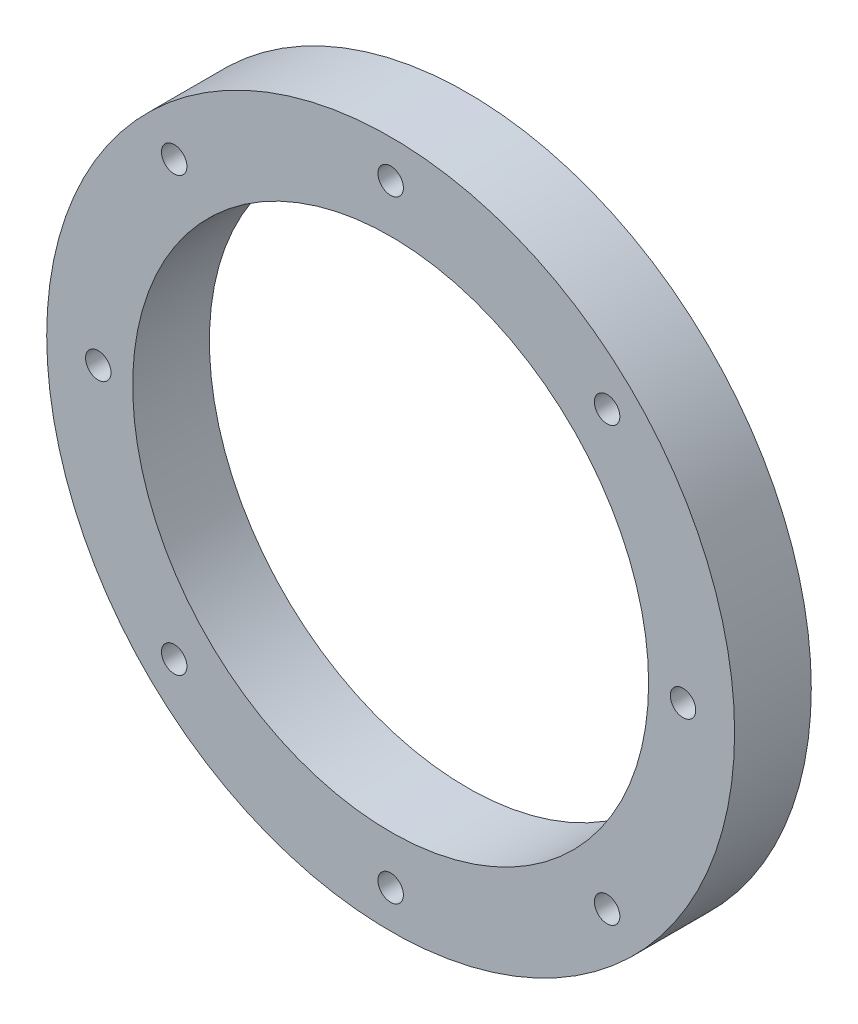
ISO-10303-21;
HEADER;
FILE_DESCRIPTION(('STEP AP214'),'2;1');
FILE_NAME('part.step','',(''),(''),'','','');
FILE_SCHEMA(('AUTOMOTIVE_DESIGN { 1 0 10303 214 1 1 1 1 }'));
ENDSEC;
DATA;
#1=APPLICATION_CONTEXT('core data for automotive mechanical design processes');
#2=APPLICATION_PROTOCOL_DEFINITION('international standard','automotive_design',2000,#1);
#3=PRODUCT_CONTEXT('',#1,'mechanical');
#4=PRODUCT('Part','Part','',(#3));
#5=PRODUCT_RELATED_PRODUCT_CATEGORY('part','',(#4));
#6=PRODUCT_DEFINITION_FORMATION('','',#4);
#7=PRODUCT_DEFINITION_CONTEXT('part definition',#1,'design');
#8=PRODUCT_DEFINITION('design','',#6,#7);
#9=PRODUCT_DEFINITION_SHAPE('','',#8);
#10=(LENGTH_UNIT() NAMED_UNIT(*) SI_UNIT(.MILLI.,.METRE.));
#11=(NAMED_UNIT(*) PLANE_ANGLE_UNIT() SI_UNIT($,.RADIAN.));
#12=(NAMED_UNIT(*) SI_UNIT($,.STERADIAN.) SOLID_ANGLE_UNIT());
#13=UNCERTAINTY_MEASURE_WITH_UNIT(LENGTH_MEASURE(1.E-05),#10,'distance_accuracy_value','');
#14=(GEOMETRIC_REPRESENTATION_CONTEXT(3) GLOBAL_UNCERTAINTY_ASSIGNED_CONTEXT((#13)) GLOBAL_UNIT_ASSIGNED_CONTEXT((#10,
#11,#12)) REPRESENTATION_CONTEXT('',''));
#15=CARTESIAN_POINT('',(0.,0.,0.));
#16=DIRECTION('',(0.,0.,1.));
#17=DIRECTION('',(1.,0.,0.));
#18=AXIS2_PLACEMENT_3D('',#15,#16,#17);
#19=CARTESIAN_POINT('',(0.,0.,11.15));
#20=DIRECTION('',(0.,0.,-1.));
#21=DIRECTION('',(-1.,0.,0.));
#22=AXIS2_PLACEMENT_3D('',#19,#20,#21);
#23=CYLINDRICAL_SURFACE('',#22,37.5);
#24=CARTESIAN_POINT('',(0.,0.,11.15));
#25=DIRECTION('',(0.,0.,1.));
#26=DIRECTION('',(1.,0.,0.));
#27=AXIS2_PLACEMENT_3D('',#24,#25,#26);
#28=CIRCLE('',#27,37.5);
#29=CARTESIAN_POINT('',(37.5,0.,11.15));
#30=VERTEX_POINT('',#29);
#31=EDGE_CURVE('E52',#30,#30,#28,.T.);
#32=ORIENTED_EDGE('',*,*,#31,.T.);
#33=EDGE_LOOP('',(#32));
#34=FACE_BOUND('',#33,.T.);
#35=CARTESIAN_POINT('',(0.,0.,0.));
#36=DIRECTION('',(0.,0.,1.));
#37=DIRECTION('',(1.,0.,0.));
#38=AXIS2_PLACEMENT_3D('',#35,#36,#37);
#39=CIRCLE('',#38,37.5);
#40=CARTESIAN_POINT('',(37.5,0.,0.));
#41=VERTEX_POINT('',#40);
#42=EDGE_CURVE('E93',#41,#41,#39,.T.);
#43=ORIENTED_EDGE('',*,*,#42,.F.);
#44=EDGE_LOOP('',(#43));
#45=FACE_BOUND('',#44,.T.);
#46=ADVANCED_FACE('F43',(#34,#45),#23,.F.);
#47=CARTESIAN_POINT('',(0.,44.5,11.15));
#48=DIRECTION('',(0.,0.,-1.));
#49=DIRECTION('',(-1.,0.,0.));
#50=AXIS2_PLACEMENT_3D('',#47,#48,#49);
#51=CYLINDRICAL_SURFACE('',#50,1.85);
#52=CARTESIAN_POINT('',(0.,44.5,11.15));
#53=DIRECTION('',(0.,0.,1.));
#54=DIRECTION('',(1.,0.,0.));
#55=AXIS2_PLACEMENT_3D('',#52,#53,#54);
#56=CIRCLE('',#55,1.85);
#57=CARTESIAN_POINT('',(1.85,44.5,11.15));
#58=VERTEX_POINT('',#57);
#59=EDGE_CURVE('E58',#58,#58,#56,.T.);
#60=ORIENTED_EDGE('',*,*,#59,.T.);
#61=EDGE_LOOP('',(#60));
#62=FACE_BOUND('',#61,.T.);
#63=CARTESIAN_POINT('',(0.,44.5,0.));
#64=DIRECTION('',(0.,0.,1.));
#65=DIRECTION('',(1.,0.,0.));
#66=AXIS2_PLACEMENT_3D('',#63,#64,#65);
#67=CIRCLE('',#66,1.85);
#68=CARTESIAN_POINT('',(1.85,44.5,0.));
#69=VERTEX_POINT('',#68);
#70=EDGE_CURVE('E90',#69,#69,#67,.T.);
#71=ORIENTED_EDGE('',*,*,#70,.F.);
#72=EDGE_LOOP('',(#71));
#73=FACE_BOUND('',#72,.T.);
#74=ADVANCED_FACE('F136',(#62,#73),#51,.F.);
#75=CARTESIAN_POINT('',(31.4662517628014,31.4662517628014,11.15));
#76=DIRECTION('',(0.,0.,-1.));
#77=DIRECTION('',(-1.,0.,0.));
#78=AXIS2_PLACEMENT_3D('',#75,#76,#77);
#79=CYLINDRICAL_SURFACE('',#78,1.85);
#80=CARTESIAN_POINT('',(31.4662517628014,31.4662517628014,11.15));
#81=DIRECTION('',(0.,0.,1.));
#82=DIRECTION('',(1.,0.,0.));
#83=AXIS2_PLACEMENT_3D('',#80,#81,#82);
#84=CIRCLE('',#83,1.85);
#85=CARTESIAN_POINT('',(33.3162517628014,31.4662517628014,11.15));
#86=VERTEX_POINT('',#85);
#87=EDGE_CURVE('E129',#86,#86,#84,.T.);
#88=ORIENTED_EDGE('',*,*,#87,.T.);
#89=EDGE_LOOP('',(#88));
#90=FACE_BOUND('',#89,.T.);
#91=CARTESIAN_POINT('',(31.4662517628014,31.4662517628014,0.));
#92=DIRECTION('',(0.,0.,1.));
#93=DIRECTION('',(1.,0.,0.));
#94=AXIS2_PLACEMENT_3D('',#91,#92,#93);
#95=CIRCLE('',#94,1.85);
#96=CARTESIAN_POINT('',(33.3162517628014,31.4662517628014,0.));
#97=VERTEX_POINT('',#96);
#98=EDGE_CURVE('E86',#97,#97,#95,.T.);
#99=ORIENTED_EDGE('',*,*,#98,.F.);
#100=EDGE_LOOP('',(#99));
#101=FACE_BOUND('',#100,.T.);
#102=ADVANCED_FACE('F154',(#90,#101),#79,.F.);
#103=CARTESIAN_POINT('',(42.5,0.,11.15));
#104=DIRECTION('',(0.,0.,-1.));
#105=DIRECTION('',(-1.,0.,0.));
#106=AXIS2_PLACEMENT_3D('',#103,#104,#105);
#107=CYLINDRICAL_SURFACE('',#106,1.85);
#108=CARTESIAN_POINT('',(42.5,0.,11.15));
#109=DIRECTION('',(0.,0.,1.));
#110=DIRECTION('',(1.,0.,0.));
#111=AXIS2_PLACEMENT_3D('',#108,#109,#110);
#112=CIRCLE('',#111,1.85);
#113=CARTESIAN_POINT('',(44.35,0.,11.15));
#114=VERTEX_POINT('',#113);
#115=EDGE_CURVE('E125',#114,#114,#112,.T.);
#116=ORIENTED_EDGE('',*,*,#115,.T.);
#117=EDGE_LOOP('',(#116));
#118=FACE_BOUND('',#117,.T.);
#119=CARTESIAN_POINT('',(42.5,0.,0.));
#120=DIRECTION('',(0.,0.,1.));
#121=DIRECTION('',(1.,0.,0.));
#122=AXIS2_PLACEMENT_3D('',#119,#120,#121);
#123=CIRCLE('',#122,1.85);
#124=CARTESIAN_POINT('',(44.35,0.,0.));
#125=VERTEX_POINT('',#124);
#126=EDGE_CURVE('E82',#125,#125,#123,.T.);
#127=ORIENTED_EDGE('',*,*,#126,.F.);
#128=EDGE_LOOP('',(#127));
#129=FACE_BOUND('',#128,.T.);
#130=ADVANCED_FACE('F161',(#118,#129),#107,.F.);
#131=CARTESIAN_POINT('',(31.4662517628014,-31.4662517628014,11.15));
#132=DIRECTION('',(0.,0.,-1.));
#133=DIRECTION('',(-1.,0.,0.));
#134=AXIS2_PLACEMENT_3D('',#131,#132,#133);
#135=CYLINDRICAL_SURFACE('',#134,1.85);
#136=CARTESIAN_POINT('',(31.4662517628014,-31.4662517628014,11.15));
#137=DIRECTION('',(0.,0.,1.));
#138=DIRECTION('',(1.,0.,0.));
#139=AXIS2_PLACEMENT_3D('',#136,#137,#138);
#140=CIRCLE('',#139,1.85);
#141=CARTESIAN_POINT('',(33.3162517628014,-31.4662517628014,11.15));
#142=VERTEX_POINT('',#141);
#143=EDGE_CURVE('E121',#142,#142,#140,.T.);
#144=ORIENTED_EDGE('',*,*,#143,.T.);
#145=EDGE_LOOP('',(#144));
#146=FACE_BOUND('',#145,.T.);
#147=CARTESIAN_POINT('',(31.4662517628014,-31.4662517628014,0.));
#148=DIRECTION('',(0.,0.,1.));
#149=DIRECTION('',(1.,0.,0.));
#150=AXIS2_PLACEMENT_3D('',#147,#148,#149);
#151=CIRCLE('',#150,1.85);
#152=CARTESIAN_POINT('',(33.3162517628014,-31.4662517628014,0.));
#153=VERTEX_POINT('',#152);
#154=EDGE_CURVE('E78',#153,#153,#151,.T.);
#155=ORIENTED_EDGE('',*,*,#154,.F.);
#156=EDGE_LOOP('',(#155));
#157=FACE_BOUND('',#156,.T.);
#158=ADVANCED_FACE('F165',(#146,#157),#135,.F.);
#159=CARTESIAN_POINT('',(0.,-44.5,11.15));
#160=DIRECTION('',(0.,0.,-1.));
#161=DIRECTION('',(-1.,0.,0.));
#162=AXIS2_PLACEMENT_3D('',#159,#160,#161);
#163=CYLINDRICAL_SURFACE('',#162,1.85);
#164=CARTESIAN_POINT('',(0.,-44.5,11.15));
#165=DIRECTION('',(0.,0.,1.));
#166=DIRECTION('',(1.,0.,0.));
#167=AXIS2_PLACEMENT_3D('',#164,#165,#166);
#168=CIRCLE('',#167,1.85);
#169=CARTESIAN_POINT('',(1.85,-44.5,11.15));
#170=VERTEX_POINT('',#169);
#171=EDGE_CURVE('E117',#170,#170,#168,.T.);
#172=ORIENTED_EDGE('',*,*,#171,.T.);
#173=EDGE_LOOP('',(#172));
#174=FACE_BOUND('',#173,.T.);
#175=CARTESIAN_POINT('',(0.,-44.5,0.));
#176=DIRECTION('',(0.,0.,1.));
#177=DIRECTION('',(1.,0.,0.));
#178=AXIS2_PLACEMENT_3D('',#175,#176,#177);
#179=CIRCLE('',#178,1.85);
#180=CARTESIAN_POINT('',(1.85,-44.5,0.));
#181=VERTEX_POINT('',#180);
#182=EDGE_CURVE('E74',#181,#181,#179,.T.);
#183=ORIENTED_EDGE('',*,*,#182,.F.);
#184=EDGE_LOOP('',(#183));
#185=FACE_BOUND('',#184,.T.);
#186=ADVANCED_FACE('F169',(#174,#185),#163,.F.);
#187=CARTESIAN_POINT('',(-31.4662517628014,-31.4662517628014,11.15));
#188=DIRECTION('',(0.,0.,-1.));
#189=DIRECTION('',(-1.,0.,0.));
#190=AXIS2_PLACEMENT_3D('',#187,#188,#189);
#191=CYLINDRICAL_SURFACE('',#190,1.85);
#192=CARTESIAN_POINT('',(-31.4662517628014,-31.4662517628014,11.15));
#193=DIRECTION('',(0.,0.,1.));
#194=DIRECTION('',(1.,0.,0.));
#195=AXIS2_PLACEMENT_3D('',#192,#193,#194);
#196=CIRCLE('',#195,1.85);
#197=CARTESIAN_POINT('',(-29.6162517628014,-31.4662517628014,11.15));
#198=VERTEX_POINT('',#197);
#199=EDGE_CURVE('E111',#198,#198,#196,.T.);
#200=ORIENTED_EDGE('',*,*,#199,.T.);
#201=EDGE_LOOP('',(#200));
#202=FACE_BOUND('',#201,.T.);
#203=CARTESIAN_POINT('',(-31.4662517628014,-31.4662517628014,0.));
#204=DIRECTION('',(0.,0.,1.));
#205=DIRECTION('',(1.,0.,0.));
#206=AXIS2_PLACEMENT_3D('',#203,#204,#205);
#207=CIRCLE('',#206,1.85);
#208=CARTESIAN_POINT('',(-29.6162517628014,-31.4662517628014,0.));
#209=VERTEX_POINT('',#208);
#210=EDGE_CURVE('E70',#209,#209,#207,.T.);
#211=ORIENTED_EDGE('',*,*,#210,.F.);
#212=EDGE_LOOP('',(#211));
#213=FACE_BOUND('',#212,.T.);
#214=ADVANCED_FACE('F173',(#202,#213),#191,.F.);
#215=CARTESIAN_POINT('',(-42.5,0.,11.15));
#216=DIRECTION('',(0.,0.,-1.));
#217=DIRECTION('',(-1.,0.,0.));
#218=AXIS2_PLACEMENT_3D('',#215,#216,#217);
#219=CYLINDRICAL_SURFACE('',#218,1.85);
#220=CARTESIAN_POINT('',(-42.5,0.,11.15));
#221=DIRECTION('',(0.,0.,1.));
#222=DIRECTION('',(1.,0.,0.));
#223=AXIS2_PLACEMENT_3D('',#220,#221,#222);
#224=CIRCLE('',#223,1.85);
#225=CARTESIAN_POINT('',(-40.65,0.,11.15));
#226=VERTEX_POINT('',#225);
#227=EDGE_CURVE('E105',#226,#226,#224,.T.);
#228=ORIENTED_EDGE('',*,*,#227,.T.);
#229=EDGE_LOOP('',(#228));
#230=FACE_BOUND('',#229,.T.);
#231=CARTESIAN_POINT('',(-42.5,0.,0.));
#232=DIRECTION('',(0.,0.,1.));
#233=DIRECTION('',(1.,0.,0.));
#234=AXIS2_PLACEMENT_3D('',#231,#232,#233);
#235=CIRCLE('',#234,1.85);
#236=CARTESIAN_POINT('',(-40.65,0.,0.));
#237=VERTEX_POINT('',#236);
#238=EDGE_CURVE('E66',#237,#237,#235,.T.);
#239=ORIENTED_EDGE('',*,*,#238,.F.);
#240=EDGE_LOOP('',(#239));
#241=FACE_BOUND('',#240,.T.);
#242=ADVANCED_FACE('F176',(#230,#241),#219,.F.);
#243=CARTESIAN_POINT('',(-31.4662517628014,31.4662517628014,11.15));
#244=DIRECTION('',(0.,0.,-1.));
#245=DIRECTION('',(-1.,0.,0.));
#246=AXIS2_PLACEMENT_3D('',#243,#244,#245);
#247=CYLINDRICAL_SURFACE('',#246,1.85);
#248=CARTESIAN_POINT('',(-31.4662517628014,31.4662517628014,11.15));
#249=DIRECTION('',(0.,0.,1.));
#250=DIRECTION('',(1.,0.,0.));
#251=AXIS2_PLACEMENT_3D('',#248,#249,#250);
#252=CIRCLE('',#251,1.85);
#253=CARTESIAN_POINT('',(-29.6162517628014,31.4662517628014,11.15));
#254=VERTEX_POINT('',#253);
#255=EDGE_CURVE('E100',#254,#254,#252,.T.);
#256=ORIENTED_EDGE('',*,*,#255,.T.);
#257=EDGE_LOOP('',(#256));
#258=FACE_BOUND('',#257,.T.);
#259=CARTESIAN_POINT('',(-31.4662517628014,31.4662517628014,0.));
#260=DIRECTION('',(0.,0.,1.));
#261=DIRECTION('',(1.,0.,0.));
#262=AXIS2_PLACEMENT_3D('',#259,#260,#261);
#263=CIRCLE('',#262,1.85);
#264=CARTESIAN_POINT('',(-29.6162517628014,31.4662517628014,0.));
#265=VERTEX_POINT('',#264);
#266=EDGE_CURVE('E62',#265,#265,#263,.T.);
#267=ORIENTED_EDGE('',*,*,#266,.F.);
#268=EDGE_LOOP('',(#267));
#269=FACE_BOUND('',#268,.T.);
#270=ADVANCED_FACE('F45',(#258,#269),#247,.F.);
#271=CARTESIAN_POINT('',(0.,0.,11.15));
#272=DIRECTION('',(0.,0.,-1.));
#273=DIRECTION('',(-1.,0.,0.));
#274=AXIS2_PLACEMENT_3D('',#271,#272,#273);
#275=CYLINDRICAL_SURFACE('',#274,50.);
#276=CARTESIAN_POINT('',(0.,0.,11.15));
#277=DIRECTION('',(0.,0.,1.));
#278=DIRECTION('',(1.,0.,0.));
#279=AXIS2_PLACEMENT_3D('',#276,#277,#278);
#280=CIRCLE('',#279,50.);
#281=CARTESIAN_POINT('',(50.,0.,11.15));
#282=VERTEX_POINT('',#281);
#283=EDGE_CURVE('E10',#282,#282,#280,.T.);
#284=ORIENTED_EDGE('',*,*,#283,.F.);
#285=EDGE_LOOP('',(#284));
#286=FACE_BOUND('',#285,.T.);
#287=CARTESIAN_POINT('',(0.,0.,0.));
#288=DIRECTION('',(0.,0.,1.));
#289=DIRECTION('',(1.,0.,0.));
#290=AXIS2_PLACEMENT_3D('',#287,#288,#289);
#291=CIRCLE('',#290,50.);
#292=CARTESIAN_POINT('',(50.,0.,0.));
#293=VERTEX_POINT('',#292);
#294=EDGE_CURVE('E47',#293,#293,#291,.T.);
#295=ORIENTED_EDGE('',*,*,#294,.T.);
#296=EDGE_LOOP('',(#295));
#297=FACE_BOUND('',#296,.T.);
#298=ADVANCED_FACE('F143',(#286,#297),#275,.T.);
#299=CARTESIAN_POINT('',(0.,0.,11.15));
#300=DIRECTION('',(0.,0.,1.));
#301=DIRECTION('',(1.,0.,0.));
#302=AXIS2_PLACEMENT_3D('',#299,#300,#301);
#303=PLANE('',#302);
#304=ORIENTED_EDGE('',*,*,#255,.F.);
#305=EDGE_LOOP('',(#304));
#306=FACE_BOUND('',#305,.T.);
#307=ORIENTED_EDGE('',*,*,#227,.F.);
#308=EDGE_LOOP('',(#307));
#309=FACE_BOUND('',#308,.T.);
#310=ORIENTED_EDGE('',*,*,#199,.F.);
#311=EDGE_LOOP('',(#310));
#312=FACE_BOUND('',#311,.T.);
#313=ORIENTED_EDGE('',*,*,#171,.F.);
#314=EDGE_LOOP('',(#313));
#315=FACE_BOUND('',#314,.T.);
#316=ORIENTED_EDGE('',*,*,#143,.F.);
#317=EDGE_LOOP('',(#316));
#318=FACE_BOUND('',#317,.T.);
#319=ORIENTED_EDGE('',*,*,#115,.F.);
#320=EDGE_LOOP('',(#319));
#321=FACE_BOUND('',#320,.T.);
#322=ORIENTED_EDGE('',*,*,#87,.F.);
#323=EDGE_LOOP('',(#322));
#324=FACE_BOUND('',#323,.T.);
#325=ORIENTED_EDGE('',*,*,#59,.F.);
#326=EDGE_LOOP('',(#325));
#327=FACE_BOUND('',#326,.T.);
#328=ORIENTED_EDGE('',*,*,#31,.F.);
#329=EDGE_LOOP('',(#328));
#330=FACE_BOUND('',#329,.T.);
#331=ORIENTED_EDGE('',*,*,#283,.T.);
#332=EDGE_LOOP('',(#331));
#333=FACE_BOUND('',#332,.T.);
#334=ADVANCED_FACE('F139',(#306,#309,#312,#315,#318,#321,#324,#327,#330,#333),#303,.T.);
#335=CARTESIAN_POINT('',(0.,0.,0.));
#336=DIRECTION('',(0.,0.,1.));
#337=DIRECTION('',(1.,0.,0.));
#338=AXIS2_PLACEMENT_3D('',#335,#336,#337);
#339=PLANE('',#338);
#340=ORIENTED_EDGE('',*,*,#266,.T.);
#341=EDGE_LOOP('',(#340));
#342=FACE_BOUND('',#341,.T.);
#343=ORIENTED_EDGE('',*,*,#238,.T.);
#344=EDGE_LOOP('',(#343));
#345=FACE_BOUND('',#344,.T.);
#346=ORIENTED_EDGE('',*,*,#210,.T.);
#347=EDGE_LOOP('',(#346));
#348=FACE_BOUND('',#347,.T.);
#349=ORIENTED_EDGE('',*,*,#182,.T.);
#350=EDGE_LOOP('',(#349));
#351=FACE_BOUND('',#350,.T.);
#352=ORIENTED_EDGE('',*,*,#154,.T.);
#353=EDGE_LOOP('',(#352));
#354=FACE_BOUND('',#353,.T.);
#355=ORIENTED_EDGE('',*,*,#126,.T.);
#356=EDGE_LOOP('',(#355));
#357=FACE_BOUND('',#356,.T.);
#358=ORIENTED_EDGE('',*,*,#98,.T.);
#359=EDGE_LOOP('',(#358));
#360=FACE_BOUND('',#359,.T.);
#361=ORIENTED_EDGE('',*,*,#70,.T.);
#362=EDGE_LOOP('',(#361));
#363=FACE_BOUND('',#362,.T.);
#364=ORIENTED_EDGE('',*,*,#42,.T.);
#365=EDGE_LOOP('',(#364));
#366=FACE_BOUND('',#365,.T.);
#367=ORIENTED_EDGE('',*,*,#294,.F.);
#368=EDGE_LOOP('',(#367));
#369=FACE_BOUND('',#368,.T.);
#370=ADVANCED_FACE('F142',(#342,#345,#348,#351,#354,#357,#360,#363,#366,#369),#339,.F.);
#371=CLOSED_SHELL('',(#46,#74,#102,#130,#158,#186,#214,#242,#270,#298,#334,#370));
#372=MANIFOLD_SOLID_BREP('B2',#371);
#373=ADVANCED_BREP_SHAPE_REPRESENTATION('',(#18,#372),#14);
#374=SHAPE_DEFINITION_REPRESENTATION(#9,#373);
ENDSEC;
END-ISO-10303-21;
